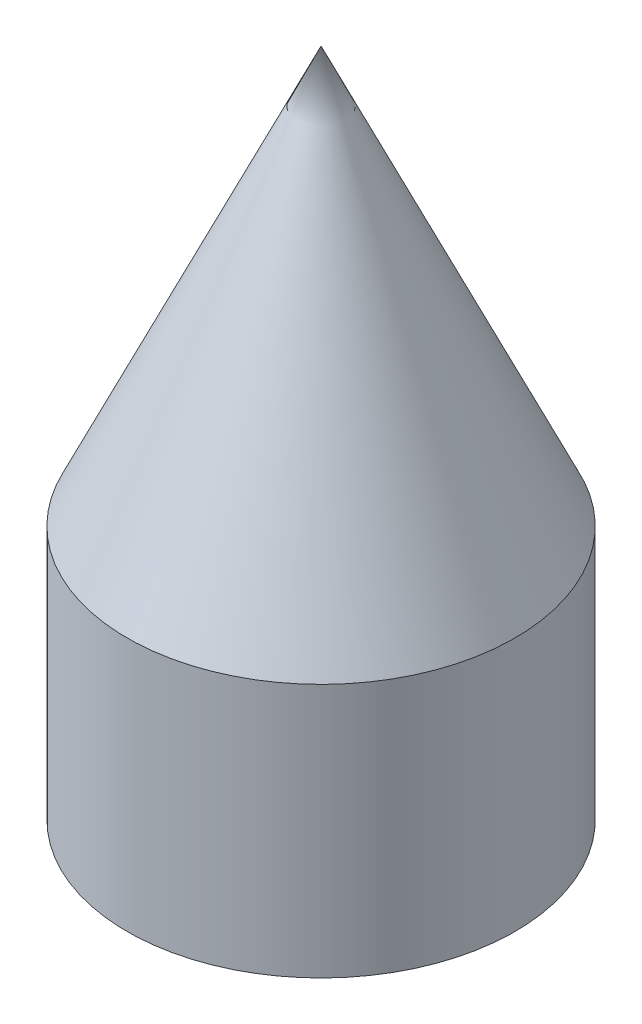
ISO-10303-21;
HEADER;
FILE_DESCRIPTION(('STEP AP214'),'2;1');
FILE_NAME('part.step','',(''),(''),'','','');
FILE_SCHEMA(('AUTOMOTIVE_DESIGN { 1 0 10303 214 1 1 1 1 }'));
ENDSEC;
DATA;
#1=APPLICATION_CONTEXT('core data for automotive mechanical design processes');
#2=APPLICATION_PROTOCOL_DEFINITION('international standard','automotive_design',2000,#1);
#3=PRODUCT_CONTEXT('',#1,'mechanical');
#4=PRODUCT('Part','Part','',(#3));
#5=PRODUCT_RELATED_PRODUCT_CATEGORY('part','',(#4));
#6=PRODUCT_DEFINITION_FORMATION('','',#4);
#7=PRODUCT_DEFINITION_CONTEXT('part definition',#1,'design');
#8=PRODUCT_DEFINITION('design','',#6,#7);
#9=PRODUCT_DEFINITION_SHAPE('','',#8);
#10=(LENGTH_UNIT() NAMED_UNIT(*) SI_UNIT(.MILLI.,.METRE.));
#11=(NAMED_UNIT(*) PLANE_ANGLE_UNIT() SI_UNIT($,.RADIAN.));
#12=(NAMED_UNIT(*) SI_UNIT($,.STERADIAN.) SOLID_ANGLE_UNIT());
#13=UNCERTAINTY_MEASURE_WITH_UNIT(LENGTH_MEASURE(1.E-05),#10,'distance_accuracy_value','');
#14=(GEOMETRIC_REPRESENTATION_CONTEXT(3) GLOBAL_UNCERTAINTY_ASSIGNED_CONTEXT((#13)) GLOBAL_UNIT_ASSIGNED_CONTEXT((#10,
#11,#12)) REPRESENTATION_CONTEXT('',''));
#15=CARTESIAN_POINT('',(0.,0.,0.));
#16=DIRECTION('',(0.,0.,1.));
#17=DIRECTION('',(1.,0.,0.));
#18=AXIS2_PLACEMENT_3D('',#15,#16,#17);
#19=CARTESIAN_POINT('',(6.1,0.,0.));
#20=DIRECTION('',(0.,-1.,0.));
#21=DIRECTION('',(0.,0.,-1.));
#22=AXIS2_PLACEMENT_3D('',#19,#20,#21);
#23=PLANE('',#22);
#24=CARTESIAN_POINT('',(0.,0.,0.));
#25=DIRECTION('',(0.,-1.,0.));
#26=DIRECTION('',(0.,0.,-1.));
#27=AXIS2_PLACEMENT_3D('',#24,#25,#26);
#28=CIRCLE('',#27,6.1);
#29=CARTESIAN_POINT('',(0.,0.,-6.1));
#30=VERTEX_POINT('',#29);
#31=EDGE_CURVE('E52',#30,#30,#28,.T.);
#32=ORIENTED_EDGE('',*,*,#31,.T.);
#33=EDGE_LOOP('',(#32));
#34=FACE_BOUND('',#33,.T.);
#35=CARTESIAN_POINT('',(0.,0.,0.));
#36=DIRECTION('',(0.,-1.,0.));
#37=DIRECTION('',(0.,0.,-1.));
#38=AXIS2_PLACEMENT_3D('',#35,#36,#37);
#39=CIRCLE('',#38,3.1);
#40=CARTESIAN_POINT('',(0.,0.,-3.1));
#41=VERTEX_POINT('',#40);
#42=EDGE_CURVE('E11',#41,#41,#39,.T.);
#43=ORIENTED_EDGE('',*,*,#42,.F.);
#44=EDGE_LOOP('',(#43));
#45=FACE_BOUND('',#44,.T.);
#46=ADVANCED_FACE('F33',(#34,#45),#23,.T.);
#47=CARTESIAN_POINT('',(0.,0.,0.));
#48=DIRECTION('',(0.,-1.,0.));
#49=DIRECTION('',(0.,0.,-1.));
#50=AXIS2_PLACEMENT_3D('',#47,#48,#49);
#51=CYLINDRICAL_SURFACE('',#50,3.1);
#52=ORIENTED_EDGE('',*,*,#42,.T.);
#53=EDGE_LOOP('',(#52));
#54=FACE_BOUND('',#53,.T.);
#55=CARTESIAN_POINT('',(0.,6.,0.));
#56=DIRECTION('',(0.,-1.,0.));
#57=DIRECTION('',(0.,0.,-1.));
#58=AXIS2_PLACEMENT_3D('',#55,#56,#57);
#59=CIRCLE('',#58,3.1);
#60=CARTESIAN_POINT('',(0.,6.,-3.1));
#61=VERTEX_POINT('',#60);
#62=EDGE_CURVE('E39',#61,#61,#59,.T.);
#63=ORIENTED_EDGE('',*,*,#62,.F.);
#64=EDGE_LOOP('',(#63));
#65=FACE_BOUND('',#64,.T.);
#66=ADVANCED_FACE('F66',(#54,#65),#51,.F.);
#67=CARTESIAN_POINT('',(3.1,6.,0.));
#68=DIRECTION('',(0.,-1.,0.));
#69=DIRECTION('',(0.,0.,-1.));
#70=AXIS2_PLACEMENT_3D('',#67,#68,#69);
#71=PLANE('',#70);
#72=ORIENTED_EDGE('',*,*,#62,.T.);
#73=EDGE_LOOP('',(#72));
#74=FACE_BOUND('',#73,.T.);
#75=ADVANCED_FACE('F46',(#74),#71,.T.);
#76=CARTESIAN_POINT('',(0.,8.,0.));
#77=DIRECTION('',(0.,-1.,0.));
#78=DIRECTION('',(0.,0.,-1.));
#79=AXIS2_PLACEMENT_3D('',#76,#77,#78);
#80=CONICAL_SURFACE('',#79,6.1,0.436332312998576);
#81=CARTESIAN_POINT('',(0.,21.0814922151085,0.));
#82=VERTEX_POINT('',#81);
#83=VERTEX_LOOP('',#82);
#84=FACE_BOUND('',#83,.T.);
#85=CARTESIAN_POINT('',(0.,8.,0.));
#86=DIRECTION('',(0.,-1.,0.));
#87=DIRECTION('',(0.,0.,-1.));
#88=AXIS2_PLACEMENT_3D('',#85,#86,#87);
#89=CIRCLE('',#88,6.1);
#90=CARTESIAN_POINT('',(0.,8.,-6.1));
#91=VERTEX_POINT('',#90);
#92=EDGE_CURVE('E50',#91,#91,#89,.T.);
#93=ORIENTED_EDGE('',*,*,#92,.F.);
#94=EDGE_LOOP('',(#93));
#95=FACE_BOUND('',#94,.T.);
#96=ADVANCED_FACE('F42',(#84,#95),#80,.T.);
#97=CARTESIAN_POINT('',(0.,0.,0.));
#98=DIRECTION('',(0.,-1.,0.));
#99=DIRECTION('',(0.,0.,-1.));
#100=AXIS2_PLACEMENT_3D('',#97,#98,#99);
#101=CYLINDRICAL_SURFACE('',#100,6.1);
#102=ORIENTED_EDGE('',*,*,#92,.T.);
#103=EDGE_LOOP('',(#102));
#104=FACE_BOUND('',#103,.T.);
#105=ORIENTED_EDGE('',*,*,#31,.F.);
#106=EDGE_LOOP('',(#105));
#107=FACE_BOUND('',#106,.T.);
#108=ADVANCED_FACE('F45',(#104,#107),#101,.T.);
#109=CLOSED_SHELL('',(#46,#66,#75,#96,#108));
#110=MANIFOLD_SOLID_BREP('B2',#109);
#111=ADVANCED_BREP_SHAPE_REPRESENTATION('',(#18,#110),#14);
#112=SHAPE_DEFINITION_REPRESENTATION(#9,#111);
ENDSEC;
END-ISO-10303-21;
